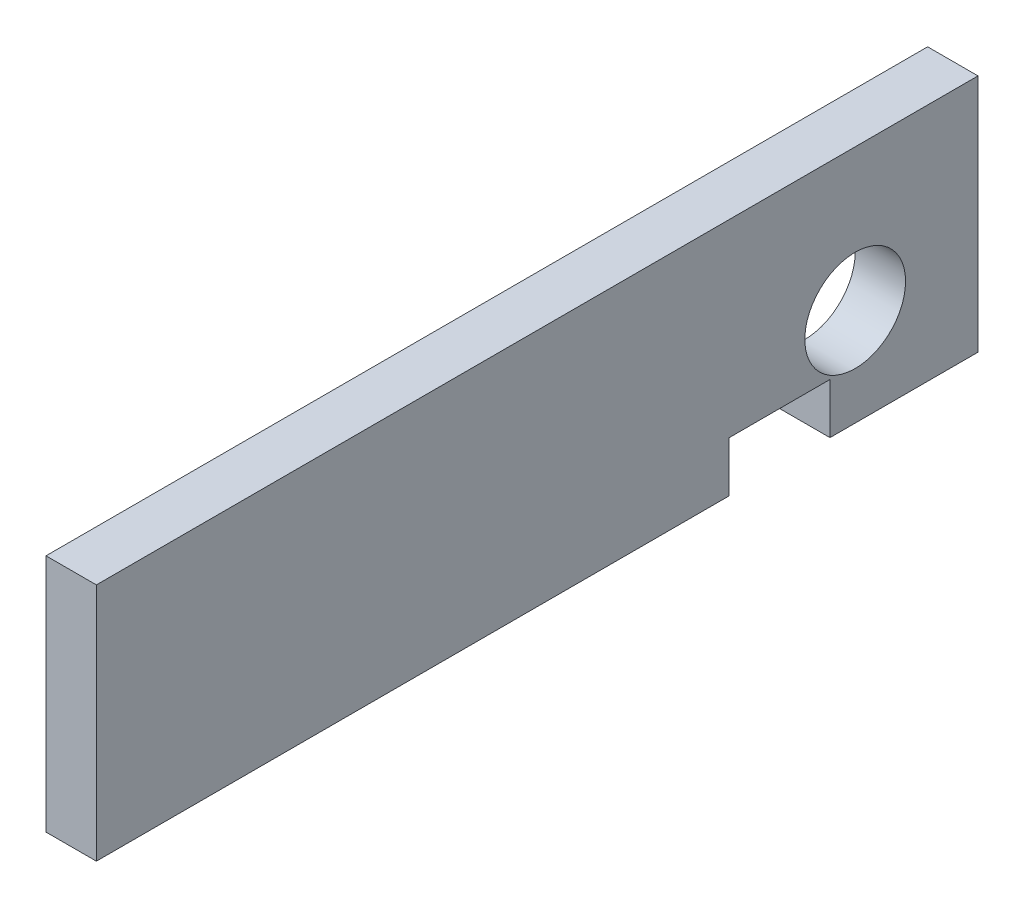
ISO-10303-21;
HEADER;
FILE_DESCRIPTION(('STEP AP214'),'2;1');
FILE_NAME('part.step','',(''),(''),'','','');
FILE_SCHEMA(('AUTOMOTIVE_DESIGN { 1 0 10303 214 1 1 1 1 }'));
ENDSEC;
DATA;
#1=APPLICATION_CONTEXT('core data for automotive mechanical design processes');
#2=APPLICATION_PROTOCOL_DEFINITION('international standard','automotive_design',2000,#1);
#3=PRODUCT_CONTEXT('',#1,'mechanical');
#4=PRODUCT('Part','Part','',(#3));
#5=PRODUCT_RELATED_PRODUCT_CATEGORY('part','',(#4));
#6=PRODUCT_DEFINITION_FORMATION('','',#4);
#7=PRODUCT_DEFINITION_CONTEXT('part definition',#1,'design');
#8=PRODUCT_DEFINITION('design','',#6,#7);
#9=PRODUCT_DEFINITION_SHAPE('','',#8);
#10=(LENGTH_UNIT() NAMED_UNIT(*) SI_UNIT(.MILLI.,.METRE.));
#11=(NAMED_UNIT(*) PLANE_ANGLE_UNIT() SI_UNIT($,.RADIAN.));
#12=(NAMED_UNIT(*) SI_UNIT($,.STERADIAN.) SOLID_ANGLE_UNIT());
#13=UNCERTAINTY_MEASURE_WITH_UNIT(LENGTH_MEASURE(1.E-05),#10,'distance_accuracy_value','');
#14=(GEOMETRIC_REPRESENTATION_CONTEXT(3) GLOBAL_UNCERTAINTY_ASSIGNED_CONTEXT((#13)) GLOBAL_UNIT_ASSIGNED_CONTEXT((#10,
#11,#12)) REPRESENTATION_CONTEXT('',''));
#15=CARTESIAN_POINT('',(0.,0.,0.));
#16=DIRECTION('',(0.,0.,1.));
#17=DIRECTION('',(1.,0.,0.));
#18=AXIS2_PLACEMENT_3D('',#15,#16,#17);
#19=CARTESIAN_POINT('',(12.7,120.65,-444.5));
#20=DIRECTION('',(1.,0.,0.));
#21=DIRECTION('',(0.,1.,0.));
#22=AXIS2_PLACEMENT_3D('',#19,#20,#21);
#23=PLANE('',#22);
#24=CARTESIAN_POINT('',(12.7,49.2252,-382.5748));
#25=DIRECTION('',(1.,0.,0.));
#26=DIRECTION('',(0.,1.,0.));
#27=AXIS2_PLACEMENT_3D('',#24,#25,#26);
#28=CIRCLE('',#27,25.4);
#29=CARTESIAN_POINT('',(12.7,49.2252,-407.9748));
#30=VERTEX_POINT('',#29);
#31=EDGE_CURVE('E107',#30,#30,#28,.T.);
#32=ORIENTED_EDGE('',*,*,#31,.F.);
#33=EDGE_LOOP('',(#32));
#34=FACE_BOUND('',#33,.T.);
#35=DIRECTION('',(0.,0.,1.));
#36=VECTOR('',#35,1.);
#37=CARTESIAN_POINT('',(12.7,0.,-444.5));
#38=LINE('',#37,#36);
#39=CARTESIAN_POINT('',(12.7,0.,-319.0748));
#40=VERTEX_POINT('',#39);
#41=CARTESIAN_POINT('',(12.7,0.,0.));
#42=VERTEX_POINT('',#41);
#43=EDGE_CURVE('E145',#40,#42,#38,.T.);
#44=ORIENTED_EDGE('',*,*,#43,.F.);
#45=DIRECTION('',(0.,1.,0.));
#46=VECTOR('',#45,1.);
#47=CARTESIAN_POINT('',(12.7,120.65,-319.0748));
#48=LINE('',#47,#46);
#49=CARTESIAN_POINT('',(12.7,25.3999999999997,-319.0748));
#50=VERTEX_POINT('',#49);
#51=EDGE_CURVE('E94',#40,#50,#48,.T.);
#52=ORIENTED_EDGE('',*,*,#51,.T.);
#53=DIRECTION('',(0.,0.,1.));
#54=VECTOR('',#53,1.);
#55=CARTESIAN_POINT('',(12.7,25.3999999999997,-444.5));
#56=LINE('',#55,#54);
#57=CARTESIAN_POINT('',(12.7,25.3999999999997,-369.8748));
#58=VERTEX_POINT('',#57);
#59=EDGE_CURVE('E100',#58,#50,#56,.T.);
#60=ORIENTED_EDGE('',*,*,#59,.F.);
#61=DIRECTION('',(0.,1.,0.));
#62=VECTOR('',#61,1.);
#63=CARTESIAN_POINT('',(12.7,120.65,-369.8748));
#64=LINE('',#63,#62);
#65=CARTESIAN_POINT('',(12.7,0.,-369.8748));
#66=VERTEX_POINT('',#65);
#67=EDGE_CURVE('E88',#66,#58,#64,.T.);
#68=ORIENTED_EDGE('',*,*,#67,.F.);
#69=CARTESIAN_POINT('',(12.7,0.,-444.5));
#70=VERTEX_POINT('',#69);
#71=EDGE_CURVE('E143',#70,#66,#38,.T.);
#72=ORIENTED_EDGE('',*,*,#71,.F.);
#73=DIRECTION('',(0.,1.,0.));
#74=VECTOR('',#73,1.);
#75=CARTESIAN_POINT('',(12.7,120.65,-444.5));
#76=LINE('',#75,#74);
#77=CARTESIAN_POINT('',(12.7,120.65,-444.5));
#78=VERTEX_POINT('',#77);
#79=EDGE_CURVE('E133',#70,#78,#76,.T.);
#80=ORIENTED_EDGE('',*,*,#79,.T.);
#81=DIRECTION('',(0.,0.,1.));
#82=VECTOR('',#81,1.);
#83=CARTESIAN_POINT('',(12.7,120.65,-444.5));
#84=LINE('',#83,#82);
#85=CARTESIAN_POINT('',(12.7,120.65,0.));
#86=VERTEX_POINT('',#85);
#87=EDGE_CURVE('E141',#78,#86,#84,.T.);
#88=ORIENTED_EDGE('',*,*,#87,.T.);
#89=DIRECTION('',(0.,1.,0.));
#90=VECTOR('',#89,1.);
#91=CARTESIAN_POINT('',(12.7,120.65,0.));
#92=LINE('',#91,#90);
#93=EDGE_CURVE('E122',#42,#86,#92,.T.);
#94=ORIENTED_EDGE('',*,*,#93,.F.);
#95=EDGE_LOOP('',(#44,#52,#60,#68,#72,#80,#88,#94));
#96=FACE_BOUND('',#95,.T.);
#97=ADVANCED_FACE('F30',(#34,#96),#23,.T.);
#98=CARTESIAN_POINT('',(-12.7,0.,-444.5));
#99=DIRECTION('',(0.,-1.,0.));
#100=DIRECTION('',(0.,0.,-1.));
#101=AXIS2_PLACEMENT_3D('',#98,#99,#100);
#102=PLANE('',#101);
#103=DIRECTION('',(0.,0.,1.));
#104=VECTOR('',#103,1.);
#105=CARTESIAN_POINT('',(-12.7,0.,-444.5));
#106=LINE('',#105,#104);
#107=CARTESIAN_POINT('',(-12.7,0.,-319.0748));
#108=VERTEX_POINT('',#107);
#109=CARTESIAN_POINT('',(-12.7,0.,0.));
#110=VERTEX_POINT('',#109);
#111=EDGE_CURVE('E139',#108,#110,#106,.T.);
#112=ORIENTED_EDGE('',*,*,#111,.F.);
#113=DIRECTION('',(1.,0.,0.));
#114=VECTOR('',#113,1.);
#115=CARTESIAN_POINT('',(-12.7,0.,-319.0748));
#116=LINE('',#115,#114);
#117=EDGE_CURVE('E11',#108,#40,#116,.T.);
#118=ORIENTED_EDGE('',*,*,#117,.T.);
#119=ORIENTED_EDGE('',*,*,#43,.T.);
#120=DIRECTION('',(1.,0.,0.));
#121=VECTOR('',#120,1.);
#122=CARTESIAN_POINT('',(-12.7,0.,0.));
#123=LINE('',#122,#121);
#124=EDGE_CURVE('E119',#110,#42,#123,.T.);
#125=ORIENTED_EDGE('',*,*,#124,.F.);
#126=EDGE_LOOP('',(#112,#118,#119,#125));
#127=FACE_BOUND('',#126,.T.);
#128=ADVANCED_FACE('F151',(#127),#102,.T.);
#129=CARTESIAN_POINT('',(-12.7,120.65,-444.5));
#130=DIRECTION('',(-1.,0.,0.));
#131=DIRECTION('',(0.,-1.,0.));
#132=AXIS2_PLACEMENT_3D('',#129,#130,#131);
#133=PLANE('',#132);
#134=CARTESIAN_POINT('',(-12.7,49.2252,-382.5748));
#135=DIRECTION('',(-1.,0.,0.));
#136=DIRECTION('',(0.,-1.,0.));
#137=AXIS2_PLACEMENT_3D('',#134,#135,#136);
#138=CIRCLE('',#137,25.4);
#139=CARTESIAN_POINT('',(-12.7,49.2252,-407.9748));
#140=VERTEX_POINT('',#139);
#141=EDGE_CURVE('E110',#140,#140,#138,.T.);
#142=ORIENTED_EDGE('',*,*,#141,.F.);
#143=EDGE_LOOP('',(#142));
#144=FACE_BOUND('',#143,.T.);
#145=DIRECTION('',(0.,-1.,0.));
#146=VECTOR('',#145,1.);
#147=CARTESIAN_POINT('',(-12.7,120.65,0.));
#148=LINE('',#147,#146);
#149=CARTESIAN_POINT('',(-12.7,120.65,0.));
#150=VERTEX_POINT('',#149);
#151=EDGE_CURVE('E116',#150,#110,#148,.T.);
#152=ORIENTED_EDGE('',*,*,#151,.F.);
#153=DIRECTION('',(0.,0.,1.));
#154=VECTOR('',#153,1.);
#155=CARTESIAN_POINT('',(-12.7,120.65,-444.5));
#156=LINE('',#155,#154);
#157=CARTESIAN_POINT('',(-12.7,120.65,-444.5));
#158=VERTEX_POINT('',#157);
#159=EDGE_CURVE('E53',#158,#150,#156,.T.);
#160=ORIENTED_EDGE('',*,*,#159,.F.);
#161=DIRECTION('',(0.,-1.,0.));
#162=VECTOR('',#161,1.);
#163=CARTESIAN_POINT('',(-12.7,120.65,-444.5));
#164=LINE('',#163,#162);
#165=CARTESIAN_POINT('',(-12.7,0.,-444.5));
#166=VERTEX_POINT('',#165);
#167=EDGE_CURVE('E128',#158,#166,#164,.T.);
#168=ORIENTED_EDGE('',*,*,#167,.T.);
#169=CARTESIAN_POINT('',(-12.7,0.,-369.8748));
#170=VERTEX_POINT('',#169);
#171=EDGE_CURVE('E146',#166,#170,#106,.T.);
#172=ORIENTED_EDGE('',*,*,#171,.T.);
#173=EDGE_CURVE('E103',#170,#108,#106,.T.);
#174=ORIENTED_EDGE('',*,*,#173,.T.);
#175=ORIENTED_EDGE('',*,*,#111,.T.);
#176=EDGE_LOOP('',(#152,#160,#168,#172,#174,#175));
#177=FACE_BOUND('',#176,.T.);
#178=ADVANCED_FACE('F32',(#144,#177),#133,.T.);
#179=CARTESIAN_POINT('',(-12.7,120.65,-444.5));
#180=DIRECTION('',(0.,1.,0.));
#181=DIRECTION('',(0.,0.,1.));
#182=AXIS2_PLACEMENT_3D('',#179,#180,#181);
#183=PLANE('',#182);
#184=DIRECTION('',(-1.,0.,0.));
#185=VECTOR('',#184,1.);
#186=CARTESIAN_POINT('',(-12.7,120.65,0.));
#187=LINE('',#186,#185);
#188=EDGE_CURVE('E125',#86,#150,#187,.T.);
#189=ORIENTED_EDGE('',*,*,#188,.F.);
#190=ORIENTED_EDGE('',*,*,#87,.F.);
#191=DIRECTION('',(-1.,0.,0.));
#192=VECTOR('',#191,1.);
#193=CARTESIAN_POINT('',(-12.7,120.65,-444.5));
#194=LINE('',#193,#192);
#195=EDGE_CURVE('E136',#78,#158,#194,.T.);
#196=ORIENTED_EDGE('',*,*,#195,.T.);
#197=ORIENTED_EDGE('',*,*,#159,.T.);
#198=EDGE_LOOP('',(#189,#190,#196,#197));
#199=FACE_BOUND('',#198,.T.);
#200=ADVANCED_FACE('F157',(#199),#183,.T.);
#201=DIRECTION('',(1.,0.,0.));
#202=VECTOR('',#201,1.);
#203=CARTESIAN_POINT('',(-12.7,0.,-369.8748));
#204=LINE('',#203,#202);
#205=EDGE_CURVE('E38',#170,#66,#204,.T.);
#206=ORIENTED_EDGE('',*,*,#205,.F.);
#207=ORIENTED_EDGE('',*,*,#171,.F.);
#208=DIRECTION('',(1.,0.,0.));
#209=VECTOR('',#208,1.);
#210=CARTESIAN_POINT('',(-12.7,0.,-444.5));
#211=LINE('',#210,#209);
#212=EDGE_CURVE('E130',#166,#70,#211,.T.);
#213=ORIENTED_EDGE('',*,*,#212,.T.);
#214=ORIENTED_EDGE('',*,*,#71,.T.);
#215=EDGE_LOOP('',(#206,#207,#213,#214));
#216=FACE_BOUND('',#215,.T.);
#217=ADVANCED_FACE('F164',(#216),#102,.T.);
#218=CARTESIAN_POINT('',(-12.7,0.,-444.5));
#219=DIRECTION('',(0.,0.,1.));
#220=DIRECTION('',(1.,0.,0.));
#221=AXIS2_PLACEMENT_3D('',#218,#219,#220);
#222=PLANE('',#221);
#223=ORIENTED_EDGE('',*,*,#167,.F.);
#224=ORIENTED_EDGE('',*,*,#195,.F.);
#225=ORIENTED_EDGE('',*,*,#79,.F.);
#226=ORIENTED_EDGE('',*,*,#212,.F.);
#227=EDGE_LOOP('',(#223,#224,#225,#226));
#228=FACE_BOUND('',#227,.T.);
#229=ADVANCED_FACE('F161',(#228),#222,.F.);
#230=CARTESIAN_POINT('',(-12.7,0.,0.));
#231=DIRECTION('',(0.,0.,1.));
#232=DIRECTION('',(1.,0.,0.));
#233=AXIS2_PLACEMENT_3D('',#230,#231,#232);
#234=PLANE('',#233);
#235=ORIENTED_EDGE('',*,*,#151,.T.);
#236=ORIENTED_EDGE('',*,*,#124,.T.);
#237=ORIENTED_EDGE('',*,*,#93,.T.);
#238=ORIENTED_EDGE('',*,*,#188,.T.);
#239=EDGE_LOOP('',(#235,#236,#237,#238));
#240=FACE_BOUND('',#239,.T.);
#241=ADVANCED_FACE('F154',(#240),#234,.T.);
#242=CARTESIAN_POINT('',(-25.4,49.2252,-382.5748));
#243=DIRECTION('',(1.,0.,0.));
#244=DIRECTION('',(0.,0.,-1.));
#245=AXIS2_PLACEMENT_3D('',#242,#243,#244);
#246=CYLINDRICAL_SURFACE('',#245,25.4);
#247=CARTESIAN_POINT('',(-12.7,49.2252,-407.9748));
#248=CARTESIAN_POINT('',(-12.4354166666667,49.2252,-407.9748));
#249=CARTESIAN_POINT('',(-12.1708333333333,49.2252,-407.9748));
#250=CARTESIAN_POINT('',(-11.6416666666667,49.2252,-407.9748));
#251=CARTESIAN_POINT('',(-11.3770833333333,49.2252,-407.9748));
#252=CARTESIAN_POINT('',(-10.8479166666667,49.2252,-407.9748));
#253=CARTESIAN_POINT('',(-10.5833333333333,49.2252,-407.9748));
#254=CARTESIAN_POINT('',(-10.0541666666667,49.2252,-407.9748));
#255=CARTESIAN_POINT('',(-9.78958333333334,49.2252,-407.9748));
#256=CARTESIAN_POINT('',(-9.26041666666667,49.2252,-407.9748));
#257=CARTESIAN_POINT('',(-8.99583333333334,49.2252,-407.9748));
#258=CARTESIAN_POINT('',(-8.46666666666667,49.2252,-407.9748));
#259=CARTESIAN_POINT('',(-8.20208333333334,49.2252,-407.9748));
#260=CARTESIAN_POINT('',(-7.67291666666667,49.2252,-407.9748));
#261=CARTESIAN_POINT('',(-7.40833333333334,49.2252,-407.9748));
#262=CARTESIAN_POINT('',(-6.87916666666667,49.2252,-407.9748));
#263=CARTESIAN_POINT('',(-6.61458333333334,49.2252,-407.9748));
#264=CARTESIAN_POINT('',(-6.08541666666667,49.2252,-407.9748));
#265=CARTESIAN_POINT('',(-5.82083333333333,49.2252,-407.9748));
#266=CARTESIAN_POINT('',(-5.29166666666667,49.2252,-407.9748));
#267=CARTESIAN_POINT('',(-5.02708333333334,49.2252,-407.9748));
#268=CARTESIAN_POINT('',(-4.49791666666667,49.2252,-407.9748));
#269=CARTESIAN_POINT('',(-4.23333333333334,49.2252,-407.9748));
#270=CARTESIAN_POINT('',(-3.70416666666667,49.2252,-407.9748));
#271=CARTESIAN_POINT('',(-3.43958333333334,49.2252,-407.9748));
#272=CARTESIAN_POINT('',(-2.91041666666667,49.2252,-407.9748));
#273=CARTESIAN_POINT('',(-2.64583333333334,49.2252,-407.9748));
#274=CARTESIAN_POINT('',(-2.11666666666667,49.2252,-407.9748));
#275=CARTESIAN_POINT('',(-1.85208333333334,49.2252,-407.9748));
#276=CARTESIAN_POINT('',(-1.32291666666667,49.2252,-407.9748));
#277=CARTESIAN_POINT('',(-1.05833333333334,49.2252,-407.9748));
#278=CARTESIAN_POINT('',(-0.52916666666667,49.2252,-407.9748));
#279=CARTESIAN_POINT('',(-0.264583333333337,49.2252,-407.9748));
#280=CARTESIAN_POINT('',(0.26458333333333,49.2252,-407.9748));
#281=CARTESIAN_POINT('',(0.529166666666663,49.2252,-407.9748));
#282=CARTESIAN_POINT('',(1.05833333333333,49.2252,-407.9748));
#283=CARTESIAN_POINT('',(1.32291666666666,49.2252,-407.9748));
#284=CARTESIAN_POINT('',(1.85208333333333,49.2252,-407.9748));
#285=CARTESIAN_POINT('',(2.11666666666666,49.2252,-407.9748));
#286=CARTESIAN_POINT('',(2.64583333333333,49.2252,-407.9748));
#287=CARTESIAN_POINT('',(2.91041666666666,49.2252,-407.9748));
#288=CARTESIAN_POINT('',(3.43958333333333,49.2252,-407.9748));
#289=CARTESIAN_POINT('',(3.70416666666666,49.2252,-407.9748));
#290=CARTESIAN_POINT('',(4.23333333333333,49.2252,-407.9748));
#291=CARTESIAN_POINT('',(4.49791666666666,49.2252,-407.9748));
#292=CARTESIAN_POINT('',(5.02708333333333,49.2252,-407.9748));
#293=CARTESIAN_POINT('',(5.29166666666666,49.2252,-407.9748));
#294=CARTESIAN_POINT('',(5.82083333333333,49.2252,-407.9748));
#295=CARTESIAN_POINT('',(6.08541666666666,49.2252,-407.9748));
#296=CARTESIAN_POINT('',(6.61458333333333,49.2252,-407.9748));
#297=CARTESIAN_POINT('',(6.87916666666666,49.2252,-407.9748));
#298=CARTESIAN_POINT('',(7.40833333333333,49.2252,-407.9748));
#299=CARTESIAN_POINT('',(7.67291666666666,49.2252,-407.9748));
#300=CARTESIAN_POINT('',(8.20208333333333,49.2252,-407.9748));
#301=CARTESIAN_POINT('',(8.46666666666666,49.2252,-407.9748));
#302=CARTESIAN_POINT('',(8.99583333333333,49.2252,-407.9748));
#303=CARTESIAN_POINT('',(9.26041666666666,49.2252,-407.9748));
#304=CARTESIAN_POINT('',(9.78958333333333,49.2252,-407.9748));
#305=CARTESIAN_POINT('',(10.0541666666667,49.2252,-407.9748));
#306=CARTESIAN_POINT('',(10.5833333333333,49.2252,-407.9748));
#307=CARTESIAN_POINT('',(10.8479166666667,49.2252,-407.9748));
#308=CARTESIAN_POINT('',(11.3770833333333,49.2252,-407.9748));
#309=CARTESIAN_POINT('',(11.6416666666667,49.2252,-407.9748));
#310=CARTESIAN_POINT('',(12.1708333333333,49.2252,-407.9748));
#311=CARTESIAN_POINT('',(12.4354166666667,49.2252,-407.9748));
#312=CARTESIAN_POINT('',(12.7,49.2252,-407.9748));
#313=B_SPLINE_CURVE_WITH_KNOTS('',3,(#247,#248,#249,#250,#251,#252,#253,#254,#255,#256,#257,
#258,#259,#260,#261,#262,#263,#264,#265,#266,#267,#268,#269,#270,#271,#272,#273,#274,#275,#276,
#277,#278,#279,#280,#281,#282,#283,#284,#285,#286,#287,#288,#289,#290,#291,#292,#293,#294,#295,
#296,#297,#298,#299,#300,#301,#302,#303,#304,#305,#306,#307,#308,#309,#310,#311,#312),
.UNSPECIFIED.,.F.,.F.,(4,2,2,2,2,2,2,2,2,2,2,2,2,2,2,2,2,2,2,2,2,2,2,2,2,2,2,2,2,2,2,2,4),(0.,
0.793749999999999,1.5875,2.38125,3.175,3.96875,4.7625,5.55625,6.35,7.14375,7.9375,8.73125,9.525,
10.31875,11.1125,11.90625,12.7,13.49375,14.2875,15.08125,15.875,16.66875,17.4625,18.25625,19.05,
19.84375,20.6375,21.43125,22.225,23.01875,23.8125,24.60625,25.4),.UNSPECIFIED.);
#314=EDGE_CURVE('BSEAM182',#140,#30,#313,.T.);
#315=ORIENTED_EDGE('',*,*,#141,.T.);
#316=ORIENTED_EDGE('',*,*,#31,.T.);
#317=ORIENTED_EDGE('',*,*,#314,.T.);
#318=ORIENTED_EDGE('',*,*,#314,.F.);
#319=EDGE_LOOP('',(#315,#317,#316,#318));
#320=FACE_BOUND('',#319,.T.);
#321=ADVANCED_FACE('F182',(#320),#246,.F.);
#322=CARTESIAN_POINT('',(22.207602216975,34.9076022169746,-319.0748));
#323=DIRECTION('',(-0.707106781186543,0.707106781186551,0.));
#324=DIRECTION('',(-0.707106781186551,-0.707106781186544,0.));
#325=AXIS2_PLACEMENT_3D('',#322,#323,#324);
#326=PLANE('',#325);
#327=ORIENTED_EDGE('',*,*,#59,.T.);
#328=DIRECTION('',(0.707106781186552,0.707106781186544,0.));
#329=VECTOR('',#328,1.);
#330=CARTESIAN_POINT('',(22.207602216975,34.9076022169746,-319.0748));
#331=LINE('',#330,#329);
#332=EDGE_CURVE('E95',#108,#50,#331,.T.);
#333=ORIENTED_EDGE('',*,*,#332,.F.);
#334=ORIENTED_EDGE('',*,*,#173,.F.);
#335=DIRECTION('',(0.707106781186552,0.707106781186544,0.));
#336=VECTOR('',#335,1.);
#337=CARTESIAN_POINT('',(22.207602216975,34.9076022169746,-369.8748));
#338=LINE('',#337,#336);
#339=EDGE_CURVE('E45',#170,#58,#338,.T.);
#340=ORIENTED_EDGE('',*,*,#339,.T.);
#341=EDGE_LOOP('',(#327,#333,#334,#340));
#342=FACE_BOUND('',#341,.T.);
#343=ADVANCED_FACE('F98',(#342),#326,.F.);
#344=CARTESIAN_POINT('',(22.207602216975,-16.0311416404366,-319.0748));
#345=DIRECTION('',(0.,0.,-1.));
#346=DIRECTION('',(-1.,0.,0.));
#347=AXIS2_PLACEMENT_3D('',#344,#345,#346);
#348=PLANE('',#347);
#349=ORIENTED_EDGE('',*,*,#117,.F.);
#350=ORIENTED_EDGE('',*,*,#332,.T.);
#351=ORIENTED_EDGE('',*,*,#51,.F.);
#352=EDGE_LOOP('',(#349,#350,#351));
#353=FACE_BOUND('',#352,.T.);
#354=ADVANCED_FACE('F188',(#353),#348,.T.);
#355=CARTESIAN_POINT('',(22.207602216975,-16.0311416404366,-369.8748));
#356=DIRECTION('',(0.,0.,-1.));
#357=DIRECTION('',(-1.,0.,0.));
#358=AXIS2_PLACEMENT_3D('',#355,#356,#357);
#359=PLANE('',#358);
#360=ORIENTED_EDGE('',*,*,#67,.T.);
#361=ORIENTED_EDGE('',*,*,#339,.F.);
#362=ORIENTED_EDGE('',*,*,#205,.T.);
#363=EDGE_LOOP('',(#360,#361,#362));
#364=FACE_BOUND('',#363,.T.);
#365=ADVANCED_FACE('F89',(#364),#359,.F.);
#366=CLOSED_SHELL('',(#97,#128,#178,#200,#217,#229,#241,#321,#343,#354,#365));
#367=MANIFOLD_SOLID_BREP('B2',#366);
#368=ADVANCED_BREP_SHAPE_REPRESENTATION('',(#18,#367),#14);
#369=SHAPE_DEFINITION_REPRESENTATION(#9,#368);
ENDSEC;
END-ISO-10303-21;
